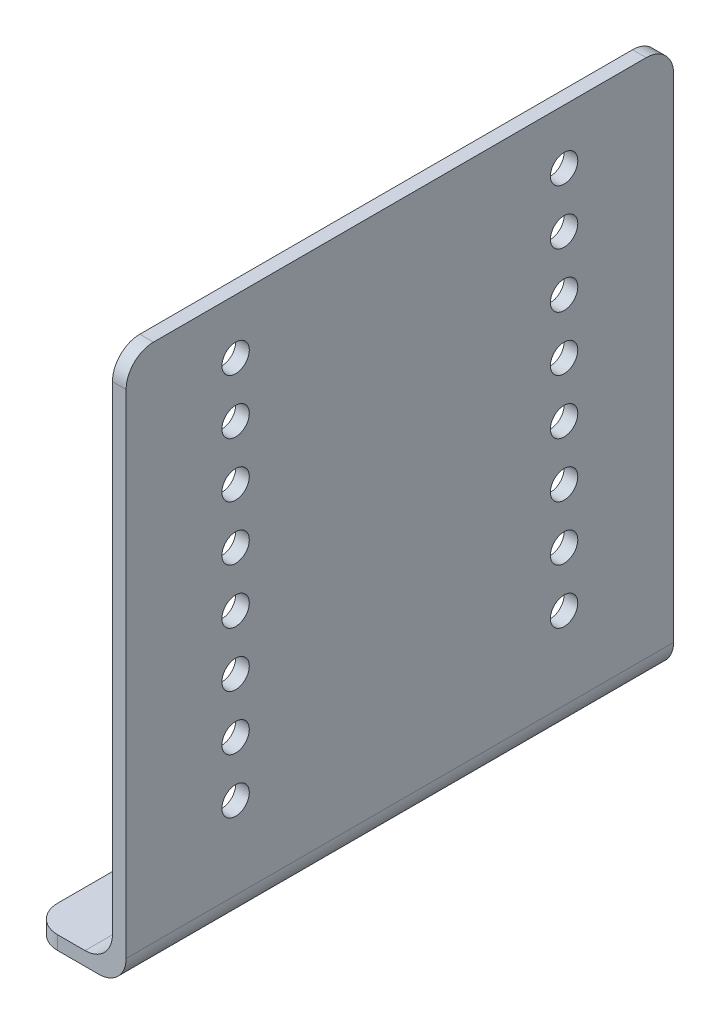
ISO-10303-21;
HEADER;
FILE_DESCRIPTION(('STEP AP214'),'2;1');
FILE_NAME('part.step','',(''),(''),'','','');
FILE_SCHEMA(('AUTOMOTIVE_DESIGN { 1 0 10303 214 1 1 1 1 }'));
ENDSEC;
DATA;
#1=APPLICATION_CONTEXT('core data for automotive mechanical design processes');
#2=APPLICATION_PROTOCOL_DEFINITION('international standard','automotive_design',2000,#1);
#3=PRODUCT_CONTEXT('',#1,'mechanical');
#4=PRODUCT('Part','Part','',(#3));
#5=PRODUCT_RELATED_PRODUCT_CATEGORY('part','',(#4));
#6=PRODUCT_DEFINITION_FORMATION('','',#4);
#7=PRODUCT_DEFINITION_CONTEXT('part definition',#1,'design');
#8=PRODUCT_DEFINITION('design','',#6,#7);
#9=PRODUCT_DEFINITION_SHAPE('','',#8);
#10=(LENGTH_UNIT() NAMED_UNIT(*) SI_UNIT(.MILLI.,.METRE.));
#11=(NAMED_UNIT(*) PLANE_ANGLE_UNIT() SI_UNIT($,.RADIAN.));
#12=(NAMED_UNIT(*) SI_UNIT($,.STERADIAN.) SOLID_ANGLE_UNIT());
#13=UNCERTAINTY_MEASURE_WITH_UNIT(LENGTH_MEASURE(1.E-05),#10,'distance_accuracy_value','');
#14=(GEOMETRIC_REPRESENTATION_CONTEXT(3) GLOBAL_UNCERTAINTY_ASSIGNED_CONTEXT((#13)) GLOBAL_UNIT_ASSIGNED_CONTEXT((#10,
#11,#12)) REPRESENTATION_CONTEXT('',''));
#15=CARTESIAN_POINT('',(0.,0.,0.));
#16=DIRECTION('',(0.,0.,1.));
#17=DIRECTION('',(1.,0.,0.));
#18=AXIS2_PLACEMENT_3D('',#15,#16,#17);
#19=CARTESIAN_POINT('',(0.,190.,-10.));
#20=DIRECTION('',(1.,0.,0.));
#21=DIRECTION('',(0.,0.,-1.));
#22=AXIS2_PLACEMENT_3D('',#19,#20,#21);
#23=PLANE('',#22);
#24=CARTESIAN_POINT('',(0.,180.,-160.));
#25=DIRECTION('',(1.,0.,0.));
#26=DIRECTION('',(0.,0.,-1.));
#27=AXIS2_PLACEMENT_3D('',#24,#25,#26);
#28=CIRCLE('',#27,4.99999999999999);
#29=CARTESIAN_POINT('',(0.,180.,-165.));
#30=VERTEX_POINT('',#29);
#31=EDGE_CURVE('E189',#30,#30,#28,.T.);
#32=ORIENTED_EDGE('',*,*,#31,.T.);
#33=EDGE_LOOP('',(#32));
#34=FACE_BOUND('',#33,.T.);
#35=CARTESIAN_POINT('',(0.,160.,-160.));
#36=DIRECTION('',(1.,0.,0.));
#37=DIRECTION('',(0.,0.,-1.));
#38=AXIS2_PLACEMENT_3D('',#35,#36,#37);
#39=CIRCLE('',#38,4.99999999999999);
#40=CARTESIAN_POINT('',(0.,160.,-165.));
#41=VERTEX_POINT('',#40);
#42=EDGE_CURVE('E193',#41,#41,#39,.T.);
#43=ORIENTED_EDGE('',*,*,#42,.T.);
#44=EDGE_LOOP('',(#43));
#45=FACE_BOUND('',#44,.T.);
#46=CARTESIAN_POINT('',(0.,140.,-160.));
#47=DIRECTION('',(1.,0.,0.));
#48=DIRECTION('',(0.,0.,-1.));
#49=AXIS2_PLACEMENT_3D('',#46,#47,#48);
#50=CIRCLE('',#49,4.99999999999999);
#51=CARTESIAN_POINT('',(0.,140.,-165.));
#52=VERTEX_POINT('',#51);
#53=EDGE_CURVE('E199',#52,#52,#50,.T.);
#54=ORIENTED_EDGE('',*,*,#53,.T.);
#55=EDGE_LOOP('',(#54));
#56=FACE_BOUND('',#55,.T.);
#57=CARTESIAN_POINT('',(0.,120.,-160.));
#58=DIRECTION('',(1.,0.,0.));
#59=DIRECTION('',(0.,0.,-1.));
#60=AXIS2_PLACEMENT_3D('',#57,#58,#59);
#61=CIRCLE('',#60,4.99999999999999);
#62=CARTESIAN_POINT('',(0.,120.,-165.));
#63=VERTEX_POINT('',#62);
#64=EDGE_CURVE('E205',#63,#63,#61,.T.);
#65=ORIENTED_EDGE('',*,*,#64,.T.);
#66=EDGE_LOOP('',(#65));
#67=FACE_BOUND('',#66,.T.);
#68=CARTESIAN_POINT('',(0.,100.,-160.));
#69=DIRECTION('',(1.,0.,0.));
#70=DIRECTION('',(0.,0.,-1.));
#71=AXIS2_PLACEMENT_3D('',#68,#69,#70);
#72=CIRCLE('',#71,4.99999999999999);
#73=CARTESIAN_POINT('',(0.,100.,-165.));
#74=VERTEX_POINT('',#73);
#75=EDGE_CURVE('E211',#74,#74,#72,.T.);
#76=ORIENTED_EDGE('',*,*,#75,.T.);
#77=EDGE_LOOP('',(#76));
#78=FACE_BOUND('',#77,.T.);
#79=CARTESIAN_POINT('',(0.,80.,-160.));
#80=DIRECTION('',(1.,0.,0.));
#81=DIRECTION('',(0.,0.,-1.));
#82=AXIS2_PLACEMENT_3D('',#79,#80,#81);
#83=CIRCLE('',#82,4.99999999999999);
#84=CARTESIAN_POINT('',(0.,80.,-165.));
#85=VERTEX_POINT('',#84);
#86=EDGE_CURVE('E217',#85,#85,#83,.T.);
#87=ORIENTED_EDGE('',*,*,#86,.T.);
#88=EDGE_LOOP('',(#87));
#89=FACE_BOUND('',#88,.T.);
#90=CARTESIAN_POINT('',(0.,60.,-160.));
#91=DIRECTION('',(1.,0.,0.));
#92=DIRECTION('',(0.,0.,-1.));
#93=AXIS2_PLACEMENT_3D('',#90,#91,#92);
#94=CIRCLE('',#93,4.99999999999999);
#95=CARTESIAN_POINT('',(0.,60.,-165.));
#96=VERTEX_POINT('',#95);
#97=EDGE_CURVE('E223',#96,#96,#94,.T.);
#98=ORIENTED_EDGE('',*,*,#97,.T.);
#99=EDGE_LOOP('',(#98));
#100=FACE_BOUND('',#99,.T.);
#101=CARTESIAN_POINT('',(0.,40.,-160.));
#102=DIRECTION('',(1.,0.,0.));
#103=DIRECTION('',(0.,0.,-1.));
#104=AXIS2_PLACEMENT_3D('',#101,#102,#103);
#105=CIRCLE('',#104,4.99999999999999);
#106=CARTESIAN_POINT('',(0.,40.,-165.));
#107=VERTEX_POINT('',#106);
#108=EDGE_CURVE('E229',#107,#107,#105,.T.);
#109=ORIENTED_EDGE('',*,*,#108,.T.);
#110=EDGE_LOOP('',(#109));
#111=FACE_BOUND('',#110,.T.);
#112=CARTESIAN_POINT('',(0.,180.,-40.));
#113=DIRECTION('',(1.,0.,0.));
#114=DIRECTION('',(0.,0.,-1.));
#115=AXIS2_PLACEMENT_3D('',#112,#113,#114);
#116=CIRCLE('',#115,5.00000000000001);
#117=CARTESIAN_POINT('',(0.,180.,-45.));
#118=VERTEX_POINT('',#117);
#119=EDGE_CURVE('E235',#118,#118,#116,.T.);
#120=ORIENTED_EDGE('',*,*,#119,.T.);
#121=EDGE_LOOP('',(#120));
#122=FACE_BOUND('',#121,.T.);
#123=CARTESIAN_POINT('',(0.,160.,-40.));
#124=DIRECTION('',(1.,0.,0.));
#125=DIRECTION('',(0.,0.,-1.));
#126=AXIS2_PLACEMENT_3D('',#123,#124,#125);
#127=CIRCLE('',#126,5.00000000000001);
#128=CARTESIAN_POINT('',(0.,160.,-45.));
#129=VERTEX_POINT('',#128);
#130=EDGE_CURVE('E241',#129,#129,#127,.T.);
#131=ORIENTED_EDGE('',*,*,#130,.T.);
#132=EDGE_LOOP('',(#131));
#133=FACE_BOUND('',#132,.T.);
#134=CARTESIAN_POINT('',(0.,140.,-40.));
#135=DIRECTION('',(1.,0.,0.));
#136=DIRECTION('',(0.,0.,-1.));
#137=AXIS2_PLACEMENT_3D('',#134,#135,#136);
#138=CIRCLE('',#137,5.00000000000001);
#139=CARTESIAN_POINT('',(0.,140.,-45.));
#140=VERTEX_POINT('',#139);
#141=EDGE_CURVE('E247',#140,#140,#138,.T.);
#142=ORIENTED_EDGE('',*,*,#141,.T.);
#143=EDGE_LOOP('',(#142));
#144=FACE_BOUND('',#143,.T.);
#145=CARTESIAN_POINT('',(0.,120.,-40.));
#146=DIRECTION('',(1.,0.,0.));
#147=DIRECTION('',(0.,0.,-1.));
#148=AXIS2_PLACEMENT_3D('',#145,#146,#147);
#149=CIRCLE('',#148,5.00000000000001);
#150=CARTESIAN_POINT('',(0.,120.,-45.));
#151=VERTEX_POINT('',#150);
#152=EDGE_CURVE('E253',#151,#151,#149,.T.);
#153=ORIENTED_EDGE('',*,*,#152,.T.);
#154=EDGE_LOOP('',(#153));
#155=FACE_BOUND('',#154,.T.);
#156=CARTESIAN_POINT('',(0.,100.,-40.));
#157=DIRECTION('',(1.,0.,0.));
#158=DIRECTION('',(0.,0.,-1.));
#159=AXIS2_PLACEMENT_3D('',#156,#157,#158);
#160=CIRCLE('',#159,5.00000000000001);
#161=CARTESIAN_POINT('',(0.,100.,-45.));
#162=VERTEX_POINT('',#161);
#163=EDGE_CURVE('E259',#162,#162,#160,.T.);
#164=ORIENTED_EDGE('',*,*,#163,.T.);
#165=EDGE_LOOP('',(#164));
#166=FACE_BOUND('',#165,.T.);
#167=CARTESIAN_POINT('',(0.,80.,-40.));
#168=DIRECTION('',(1.,0.,0.));
#169=DIRECTION('',(0.,0.,-1.));
#170=AXIS2_PLACEMENT_3D('',#167,#168,#169);
#171=CIRCLE('',#170,5.00000000000001);
#172=CARTESIAN_POINT('',(0.,80.,-45.));
#173=VERTEX_POINT('',#172);
#174=EDGE_CURVE('E265',#173,#173,#171,.T.);
#175=ORIENTED_EDGE('',*,*,#174,.T.);
#176=EDGE_LOOP('',(#175));
#177=FACE_BOUND('',#176,.T.);
#178=CARTESIAN_POINT('',(0.,60.,-40.));
#179=DIRECTION('',(1.,0.,0.));
#180=DIRECTION('',(0.,0.,-1.));
#181=AXIS2_PLACEMENT_3D('',#178,#179,#180);
#182=CIRCLE('',#181,5.00000000000001);
#183=CARTESIAN_POINT('',(0.,60.,-45.));
#184=VERTEX_POINT('',#183);
#185=EDGE_CURVE('E271',#184,#184,#182,.T.);
#186=ORIENTED_EDGE('',*,*,#185,.T.);
#187=EDGE_LOOP('',(#186));
#188=FACE_BOUND('',#187,.T.);
#189=CARTESIAN_POINT('',(0.,40.,-40.));
#190=DIRECTION('',(1.,0.,0.));
#191=DIRECTION('',(0.,0.,-1.));
#192=AXIS2_PLACEMENT_3D('',#189,#190,#191);
#193=CIRCLE('',#192,5.00000000000001);
#194=CARTESIAN_POINT('',(0.,40.,-45.));
#195=VERTEX_POINT('',#194);
#196=EDGE_CURVE('E277',#195,#195,#193,.T.);
#197=ORIENTED_EDGE('',*,*,#196,.T.);
#198=EDGE_LOOP('',(#197));
#199=FACE_BOUND('',#198,.T.);
#200=DIRECTION('',(0.,0.,1.));
#201=VECTOR('',#200,1.);
#202=CARTESIAN_POINT('',(0.,15.,-200.));
#203=LINE('',#202,#201);
#204=CARTESIAN_POINT('',(0.,15.,-200.));
#205=VERTEX_POINT('',#204);
#206=CARTESIAN_POINT('',(0.,15.,0.));
#207=VERTEX_POINT('',#206);
#208=EDGE_CURVE('E163',#205,#207,#203,.T.);
#209=ORIENTED_EDGE('',*,*,#208,.T.);
#210=DIRECTION('',(0.,-1.,0.));
#211=VECTOR('',#210,1.);
#212=CARTESIAN_POINT('',(0.,0.,0.));
#213=LINE('',#212,#211);
#214=CARTESIAN_POINT('',(0.,190.,0.));
#215=VERTEX_POINT('',#214);
#216=EDGE_CURVE('E283',#215,#207,#213,.T.);
#217=ORIENTED_EDGE('',*,*,#216,.F.);
#218=CARTESIAN_POINT('',(0.,190.,-10.));
#219=DIRECTION('',(1.,0.,0.));
#220=DIRECTION('',(0.,0.,-1.));
#221=AXIS2_PLACEMENT_3D('',#218,#219,#220);
#222=CIRCLE('',#221,10.);
#223=CARTESIAN_POINT('',(0.,200.,-10.0000000000001));
#224=VERTEX_POINT('',#223);
#225=EDGE_CURVE('E290',#224,#215,#222,.T.);
#226=ORIENTED_EDGE('',*,*,#225,.F.);
#227=DIRECTION('',(0.,0.,1.));
#228=VECTOR('',#227,1.);
#229=CARTESIAN_POINT('',(0.,200.,-10.0000000000001));
#230=LINE('',#229,#228);
#231=CARTESIAN_POINT('',(0.,200.,-190.));
#232=VERTEX_POINT('',#231);
#233=EDGE_CURVE('E305',#232,#224,#230,.T.);
#234=ORIENTED_EDGE('',*,*,#233,.F.);
#235=CARTESIAN_POINT('',(0.,190.,-190.));
#236=DIRECTION('',(1.,0.,0.));
#237=DIRECTION('',(0.,0.,1.));
#238=AXIS2_PLACEMENT_3D('',#235,#236,#237);
#239=CIRCLE('',#238,10.);
#240=CARTESIAN_POINT('',(0.,190.,-200.));
#241=VERTEX_POINT('',#240);
#242=EDGE_CURVE('E303',#241,#232,#239,.T.);
#243=ORIENTED_EDGE('',*,*,#242,.F.);
#244=DIRECTION('',(0.,1.,0.));
#245=VECTOR('',#244,1.);
#246=CARTESIAN_POINT('',(0.,0.,-200.));
#247=LINE('',#246,#245);
#248=EDGE_CURVE('E301',#205,#241,#247,.T.);
#249=ORIENTED_EDGE('',*,*,#248,.F.);
#250=EDGE_LOOP('',(#209,#217,#226,#234,#243,#249));
#251=FACE_BOUND('',#250,.T.);
#252=ADVANCED_FACE('F35',(#34,#45,#56,#67,#78,#89,#100,#111,#122,#133,#144,#155,#166,#177,#188,
#199,#251),#23,.F.);
#253=DIRECTION('',(0.,-1.,0.));
#254=VECTOR('',#253,1.);
#255=CARTESIAN_POINT('',(0.,0.,-199.496057237048));
#256=LINE('',#255,#254);
#257=CARTESIAN_POINT('',(0.,5.,-199.496057237048));
#258=VERTEX_POINT('',#257);
#259=CARTESIAN_POINT('',(0.,1.33974596215562,-199.496057237048));
#260=VERTEX_POINT('',#259);
#261=EDGE_CURVE('E173',#258,#260,#256,.T.);
#262=ORIENTED_EDGE('',*,*,#261,.F.);
#263=DIRECTION('',(0.,0.,1.));
#264=VECTOR('',#263,1.);
#265=CARTESIAN_POINT('',(0.,5.,-200.));
#266=LINE('',#265,#264);
#267=CARTESIAN_POINT('',(0.,5.,-200.));
#268=VERTEX_POINT('',#267);
#269=EDGE_CURVE('E149',#268,#258,#266,.T.);
#270=ORIENTED_EDGE('',*,*,#269,.F.);
#271=CARTESIAN_POINT('',(0.,1.33974596215562,-200.));
#272=VERTEX_POINT('',#271);
#273=EDGE_CURVE('E158',#272,#268,#247,.T.);
#274=ORIENTED_EDGE('',*,*,#273,.F.);
#275=DIRECTION('',(0.,0.,1.));
#276=VECTOR('',#275,1.);
#277=CARTESIAN_POINT('',(0.,1.33974596215562,-200.));
#278=LINE('',#277,#276);
#279=EDGE_CURVE('E327',#272,#260,#278,.T.);
#280=ORIENTED_EDGE('',*,*,#279,.T.);
#281=EDGE_LOOP('',(#262,#270,#274,#280));
#282=FACE_BOUND('',#281,.T.);
#283=ADVANCED_FACE('F387',(#282),#23,.F.);
#284=CARTESIAN_POINT('',(5.,190.,-10.));
#285=DIRECTION('',(1.,0.,0.));
#286=DIRECTION('',(0.,0.,-1.));
#287=AXIS2_PLACEMENT_3D('',#284,#285,#286);
#288=PLANE('',#287);
#289=CARTESIAN_POINT('',(5.,160.,-160.));
#290=DIRECTION('',(1.,0.,0.));
#291=DIRECTION('',(0.,0.,-1.));
#292=AXIS2_PLACEMENT_3D('',#289,#290,#291);
#293=CIRCLE('',#292,4.99999999999999);
#294=CARTESIAN_POINT('',(5.,160.,-165.));
#295=VERTEX_POINT('',#294);
#296=EDGE_CURVE('E196',#295,#295,#293,.T.);
#297=ORIENTED_EDGE('',*,*,#296,.F.);
#298=EDGE_LOOP('',(#297));
#299=FACE_BOUND('',#298,.T.);
#300=CARTESIAN_POINT('',(5.,120.,-160.));
#301=DIRECTION('',(1.,0.,0.));
#302=DIRECTION('',(0.,0.,-1.));
#303=AXIS2_PLACEMENT_3D('',#300,#301,#302);
#304=CIRCLE('',#303,4.99999999999999);
#305=CARTESIAN_POINT('',(5.,120.,-165.));
#306=VERTEX_POINT('',#305);
#307=EDGE_CURVE('E208',#306,#306,#304,.T.);
#308=ORIENTED_EDGE('',*,*,#307,.F.);
#309=EDGE_LOOP('',(#308));
#310=FACE_BOUND('',#309,.T.);
#311=CARTESIAN_POINT('',(5.,80.,-160.));
#312=DIRECTION('',(1.,0.,0.));
#313=DIRECTION('',(0.,0.,-1.));
#314=AXIS2_PLACEMENT_3D('',#311,#312,#313);
#315=CIRCLE('',#314,4.99999999999999);
#316=CARTESIAN_POINT('',(5.,80.,-165.));
#317=VERTEX_POINT('',#316);
#318=EDGE_CURVE('E220',#317,#317,#315,.T.);
#319=ORIENTED_EDGE('',*,*,#318,.F.);
#320=EDGE_LOOP('',(#319));
#321=FACE_BOUND('',#320,.T.);
#322=CARTESIAN_POINT('',(5.,40.,-160.));
#323=DIRECTION('',(1.,0.,0.));
#324=DIRECTION('',(0.,0.,-1.));
#325=AXIS2_PLACEMENT_3D('',#322,#323,#324);
#326=CIRCLE('',#325,4.99999999999999);
#327=CARTESIAN_POINT('',(5.,40.,-165.));
#328=VERTEX_POINT('',#327);
#329=EDGE_CURVE('E232',#328,#328,#326,.T.);
#330=ORIENTED_EDGE('',*,*,#329,.F.);
#331=EDGE_LOOP('',(#330));
#332=FACE_BOUND('',#331,.T.);
#333=CARTESIAN_POINT('',(5.,160.,-40.));
#334=DIRECTION('',(1.,0.,0.));
#335=DIRECTION('',(0.,0.,-1.));
#336=AXIS2_PLACEMENT_3D('',#333,#334,#335);
#337=CIRCLE('',#336,5.00000000000001);
#338=CARTESIAN_POINT('',(5.,160.,-45.));
#339=VERTEX_POINT('',#338);
#340=EDGE_CURVE('E244',#339,#339,#337,.T.);
#341=ORIENTED_EDGE('',*,*,#340,.F.);
#342=EDGE_LOOP('',(#341));
#343=FACE_BOUND('',#342,.T.);
#344=CARTESIAN_POINT('',(5.,120.,-40.));
#345=DIRECTION('',(1.,0.,0.));
#346=DIRECTION('',(0.,0.,-1.));
#347=AXIS2_PLACEMENT_3D('',#344,#345,#346);
#348=CIRCLE('',#347,5.00000000000001);
#349=CARTESIAN_POINT('',(5.,120.,-45.));
#350=VERTEX_POINT('',#349);
#351=EDGE_CURVE('E256',#350,#350,#348,.T.);
#352=ORIENTED_EDGE('',*,*,#351,.F.);
#353=EDGE_LOOP('',(#352));
#354=FACE_BOUND('',#353,.T.);
#355=CARTESIAN_POINT('',(5.,80.,-40.));
#356=DIRECTION('',(1.,0.,0.));
#357=DIRECTION('',(0.,0.,-1.));
#358=AXIS2_PLACEMENT_3D('',#355,#356,#357);
#359=CIRCLE('',#358,5.00000000000001);
#360=CARTESIAN_POINT('',(5.,80.,-45.));
#361=VERTEX_POINT('',#360);
#362=EDGE_CURVE('E268',#361,#361,#359,.T.);
#363=ORIENTED_EDGE('',*,*,#362,.F.);
#364=EDGE_LOOP('',(#363));
#365=FACE_BOUND('',#364,.T.);
#366=CARTESIAN_POINT('',(5.,40.,-40.));
#367=DIRECTION('',(1.,0.,0.));
#368=DIRECTION('',(0.,0.,-1.));
#369=AXIS2_PLACEMENT_3D('',#366,#367,#368);
#370=CIRCLE('',#369,5.00000000000001);
#371=CARTESIAN_POINT('',(5.,40.,-45.));
#372=VERTEX_POINT('',#371);
#373=EDGE_CURVE('E280',#372,#372,#370,.T.);
#374=ORIENTED_EDGE('',*,*,#373,.F.);
#375=EDGE_LOOP('',(#374));
#376=FACE_BOUND('',#375,.T.);
#377=DIRECTION('',(0.,-1.,0.));
#378=VECTOR('',#377,1.);
#379=CARTESIAN_POINT('',(5.,0.,0.));
#380=LINE('',#379,#378);
#381=CARTESIAN_POINT('',(5.,190.,0.));
#382=VERTEX_POINT('',#381);
#383=CARTESIAN_POINT('',(5.,10.,0.));
#384=VERTEX_POINT('',#383);
#385=EDGE_CURVE('E286',#382,#384,#380,.T.);
#386=ORIENTED_EDGE('',*,*,#385,.T.);
#387=DIRECTION('',(0.,0.,-1.));
#388=VECTOR('',#387,1.);
#389=CARTESIAN_POINT('',(5.,10.,-200.));
#390=LINE('',#389,#388);
#391=CARTESIAN_POINT('',(5.,10.,-200.));
#392=VERTEX_POINT('',#391);
#393=EDGE_CURVE('E322',#384,#392,#390,.T.);
#394=ORIENTED_EDGE('',*,*,#393,.T.);
#395=DIRECTION('',(0.,1.,0.));
#396=VECTOR('',#395,1.);
#397=CARTESIAN_POINT('',(5.,0.,-200.));
#398=LINE('',#397,#396);
#399=CARTESIAN_POINT('',(5.,190.,-200.));
#400=VERTEX_POINT('',#399);
#401=EDGE_CURVE('E289',#392,#400,#398,.T.);
#402=ORIENTED_EDGE('',*,*,#401,.T.);
#403=CARTESIAN_POINT('',(5.,190.,-190.));
#404=DIRECTION('',(1.,0.,0.));
#405=DIRECTION('',(0.,0.,1.));
#406=AXIS2_PLACEMENT_3D('',#403,#404,#405);
#407=CIRCLE('',#406,10.);
#408=CARTESIAN_POINT('',(5.,200.,-190.));
#409=VERTEX_POINT('',#408);
#410=EDGE_CURVE('E292',#400,#409,#407,.T.);
#411=ORIENTED_EDGE('',*,*,#410,.T.);
#412=DIRECTION('',(0.,0.,1.));
#413=VECTOR('',#412,1.);
#414=CARTESIAN_POINT('',(5.,200.,-10.0000000000001));
#415=LINE('',#414,#413);
#416=CARTESIAN_POINT('',(5.,200.,-10.0000000000001));
#417=VERTEX_POINT('',#416);
#418=EDGE_CURVE('E294',#409,#417,#415,.T.);
#419=ORIENTED_EDGE('',*,*,#418,.T.);
#420=CARTESIAN_POINT('',(5.,190.,-10.));
#421=DIRECTION('',(1.,0.,0.));
#422=DIRECTION('',(0.,0.,-1.));
#423=AXIS2_PLACEMENT_3D('',#420,#421,#422);
#424=CIRCLE('',#423,10.);
#425=EDGE_CURVE('E296',#417,#382,#424,.T.);
#426=ORIENTED_EDGE('',*,*,#425,.T.);
#427=EDGE_LOOP('',(#386,#394,#402,#411,#419,#426));
#428=FACE_BOUND('',#427,.T.);
#429=CARTESIAN_POINT('',(5.,60.,-40.));
#430=DIRECTION('',(1.,0.,0.));
#431=DIRECTION('',(0.,0.,-1.));
#432=AXIS2_PLACEMENT_3D('',#429,#430,#431);
#433=CIRCLE('',#432,5.00000000000001);
#434=CARTESIAN_POINT('',(5.,60.,-45.));
#435=VERTEX_POINT('',#434);
#436=EDGE_CURVE('E274',#435,#435,#433,.T.);
#437=ORIENTED_EDGE('',*,*,#436,.F.);
#438=EDGE_LOOP('',(#437));
#439=FACE_BOUND('',#438,.T.);
#440=CARTESIAN_POINT('',(5.,100.,-40.));
#441=DIRECTION('',(1.,0.,0.));
#442=DIRECTION('',(0.,0.,-1.));
#443=AXIS2_PLACEMENT_3D('',#440,#441,#442);
#444=CIRCLE('',#443,5.00000000000001);
#445=CARTESIAN_POINT('',(5.,100.,-45.));
#446=VERTEX_POINT('',#445);
#447=EDGE_CURVE('E262',#446,#446,#444,.T.);
#448=ORIENTED_EDGE('',*,*,#447,.F.);
#449=EDGE_LOOP('',(#448));
#450=FACE_BOUND('',#449,.T.);
#451=CARTESIAN_POINT('',(5.,140.,-40.));
#452=DIRECTION('',(1.,0.,0.));
#453=DIRECTION('',(0.,0.,-1.));
#454=AXIS2_PLACEMENT_3D('',#451,#452,#453);
#455=CIRCLE('',#454,5.00000000000001);
#456=CARTESIAN_POINT('',(5.,140.,-45.));
#457=VERTEX_POINT('',#456);
#458=EDGE_CURVE('E250',#457,#457,#455,.T.);
#459=ORIENTED_EDGE('',*,*,#458,.F.);
#460=EDGE_LOOP('',(#459));
#461=FACE_BOUND('',#460,.T.);
#462=CARTESIAN_POINT('',(5.,180.,-40.));
#463=DIRECTION('',(1.,0.,0.));
#464=DIRECTION('',(0.,0.,-1.));
#465=AXIS2_PLACEMENT_3D('',#462,#463,#464);
#466=CIRCLE('',#465,5.00000000000001);
#467=CARTESIAN_POINT('',(5.,180.,-45.));
#468=VERTEX_POINT('',#467);
#469=EDGE_CURVE('E238',#468,#468,#466,.T.);
#470=ORIENTED_EDGE('',*,*,#469,.F.);
#471=EDGE_LOOP('',(#470));
#472=FACE_BOUND('',#471,.T.);
#473=CARTESIAN_POINT('',(5.,60.,-160.));
#474=DIRECTION('',(1.,0.,0.));
#475=DIRECTION('',(0.,0.,-1.));
#476=AXIS2_PLACEMENT_3D('',#473,#474,#475);
#477=CIRCLE('',#476,4.99999999999999);
#478=CARTESIAN_POINT('',(5.,60.,-165.));
#479=VERTEX_POINT('',#478);
#480=EDGE_CURVE('E226',#479,#479,#477,.T.);
#481=ORIENTED_EDGE('',*,*,#480,.F.);
#482=EDGE_LOOP('',(#481));
#483=FACE_BOUND('',#482,.T.);
#484=CARTESIAN_POINT('',(5.,100.,-160.));
#485=DIRECTION('',(1.,0.,0.));
#486=DIRECTION('',(0.,0.,-1.));
#487=AXIS2_PLACEMENT_3D('',#484,#485,#486);
#488=CIRCLE('',#487,4.99999999999999);
#489=CARTESIAN_POINT('',(5.,100.,-165.));
#490=VERTEX_POINT('',#489);
#491=EDGE_CURVE('E214',#490,#490,#488,.T.);
#492=ORIENTED_EDGE('',*,*,#491,.F.);
#493=EDGE_LOOP('',(#492));
#494=FACE_BOUND('',#493,.T.);
#495=CARTESIAN_POINT('',(5.,140.,-160.));
#496=DIRECTION('',(1.,0.,0.));
#497=DIRECTION('',(0.,0.,-1.));
#498=AXIS2_PLACEMENT_3D('',#495,#496,#497);
#499=CIRCLE('',#498,4.99999999999999);
#500=CARTESIAN_POINT('',(5.,140.,-165.));
#501=VERTEX_POINT('',#500);
#502=EDGE_CURVE('E202',#501,#501,#499,.T.);
#503=ORIENTED_EDGE('',*,*,#502,.F.);
#504=EDGE_LOOP('',(#503));
#505=FACE_BOUND('',#504,.T.);
#506=CARTESIAN_POINT('',(5.,180.,-160.));
#507=DIRECTION('',(1.,0.,0.));
#508=DIRECTION('',(0.,0.,-1.));
#509=AXIS2_PLACEMENT_3D('',#506,#507,#508);
#510=CIRCLE('',#509,4.99999999999999);
#511=CARTESIAN_POINT('',(5.,180.,-165.));
#512=VERTEX_POINT('',#511);
#513=EDGE_CURVE('E190',#512,#512,#510,.T.);
#514=ORIENTED_EDGE('',*,*,#513,.F.);
#515=EDGE_LOOP('',(#514));
#516=FACE_BOUND('',#515,.T.);
#517=ADVANCED_FACE('F393',(#299,#310,#321,#332,#343,#354,#365,#376,#428,#439,#450,#461,#472,
#483,#494,#505,#516),#288,.T.);
#518=CARTESIAN_POINT('',(5.,0.,0.));
#519=DIRECTION('',(0.,0.,-1.));
#520=DIRECTION('',(-1.,0.,0.));
#521=AXIS2_PLACEMENT_3D('',#518,#519,#520);
#522=PLANE('',#521);
#523=DIRECTION('',(1.,0.,0.));
#524=VECTOR('',#523,1.);
#525=CARTESIAN_POINT('',(-30.,5.,0.));
#526=LINE('',#525,#524);
#527=CARTESIAN_POINT('',(-20.,5.,0.));
#528=VERTEX_POINT('',#527);
#529=CARTESIAN_POINT('',(-10.,5.,0.));
#530=VERTEX_POINT('',#529);
#531=EDGE_CURVE('E185',#528,#530,#526,.T.);
#532=ORIENTED_EDGE('',*,*,#531,.F.);
#533=DIRECTION('',(0.,1.,0.));
#534=VECTOR('',#533,1.);
#535=CARTESIAN_POINT('',(-20.,0.,0.));
#536=LINE('',#535,#534);
#537=CARTESIAN_POINT('',(-20.,0.,0.));
#538=VERTEX_POINT('',#537);
#539=EDGE_CURVE('E11',#528,#538,#536,.F.);
#540=ORIENTED_EDGE('',*,*,#539,.T.);
#541=DIRECTION('',(-1.,0.,0.));
#542=VECTOR('',#541,1.);
#543=CARTESIAN_POINT('',(5.,0.,0.));
#544=LINE('',#543,#542);
#545=CARTESIAN_POINT('',(-5.,0.,0.));
#546=VERTEX_POINT('',#545);
#547=EDGE_CURVE('E319',#546,#538,#544,.T.);
#548=ORIENTED_EDGE('',*,*,#547,.F.);
#549=CARTESIAN_POINT('',(-5.,10.,0.));
#550=DIRECTION('',(0.,0.,-1.));
#551=DIRECTION('',(-1.,0.,0.));
#552=AXIS2_PLACEMENT_3D('',#549,#550,#551);
#553=CIRCLE('',#552,10.);
#554=EDGE_CURVE('E334',#546,#384,#553,.F.);
#555=ORIENTED_EDGE('',*,*,#554,.T.);
#556=ORIENTED_EDGE('',*,*,#385,.F.);
#557=DIRECTION('',(-1.,0.,0.));
#558=VECTOR('',#557,1.);
#559=CARTESIAN_POINT('',(5.,190.,0.));
#560=LINE('',#559,#558);
#561=EDGE_CURVE('E298',#382,#215,#560,.T.);
#562=ORIENTED_EDGE('',*,*,#561,.T.);
#563=ORIENTED_EDGE('',*,*,#216,.T.);
#564=CARTESIAN_POINT('',(-10.,15.,0.));
#565=DIRECTION('',(0.,0.,-1.));
#566=DIRECTION('',(1.,0.,0.));
#567=AXIS2_PLACEMENT_3D('',#564,#565,#566);
#568=CIRCLE('',#567,10.);
#569=EDGE_CURVE('E164',#207,#530,#568,.T.);
#570=ORIENTED_EDGE('',*,*,#569,.T.);
#571=EDGE_LOOP('',(#532,#540,#548,#555,#556,#562,#563,#570));
#572=FACE_BOUND('',#571,.T.);
#573=ADVANCED_FACE('F373',(#572),#522,.F.);
#574=CARTESIAN_POINT('',(5.,0.,0.));
#575=DIRECTION('',(0.,1.,0.));
#576=DIRECTION('',(0.,0.,1.));
#577=AXIS2_PLACEMENT_3D('',#574,#575,#576);
#578=PLANE('',#577);
#579=CARTESIAN_POINT('',(-20.,0.,-169.496057237048));
#580=DIRECTION('',(0.,1.,0.));
#581=DIRECTION('',(0.,0.,1.));
#582=AXIS2_PLACEMENT_3D('',#579,#580,#581);
#583=CIRCLE('',#582,5.);
#584=CARTESIAN_POINT('',(-20.,0.,-164.496057237048));
#585=VERTEX_POINT('',#584);
#586=EDGE_CURVE('E167',#585,#585,#583,.T.);
#587=ORIENTED_EDGE('',*,*,#586,.T.);
#588=EDGE_LOOP('',(#587));
#589=FACE_BOUND('',#588,.T.);
#590=CARTESIAN_POINT('',(-20.,0.,-29.4960572370478));
#591=DIRECTION('',(0.,1.,0.));
#592=DIRECTION('',(0.,0.,1.));
#593=AXIS2_PLACEMENT_3D('',#590,#591,#592);
#594=CIRCLE('',#593,5.);
#595=CARTESIAN_POINT('',(-20.,0.,-24.4960572370478));
#596=VERTEX_POINT('',#595);
#597=EDGE_CURVE('E752',#596,#596,#594,.T.);
#598=ORIENTED_EDGE('',*,*,#597,.T.);
#599=EDGE_LOOP('',(#598));
#600=FACE_BOUND('',#599,.T.);
#601=DIRECTION('',(0.,0.,1.));
#602=VECTOR('',#601,1.);
#603=CARTESIAN_POINT('',(-30.,0.,-199.496057237048));
#604=LINE('',#603,#602);
#605=CARTESIAN_POINT('',(-30.,0.,-189.496057237048));
#606=VERTEX_POINT('',#605);
#607=CARTESIAN_POINT('',(-30.,0.,-10.));
#608=VERTEX_POINT('',#607);
#609=EDGE_CURVE('E175',#606,#608,#604,.T.);
#610=ORIENTED_EDGE('',*,*,#609,.F.);
#611=CARTESIAN_POINT('',(-20.,0.,-189.496057237048));
#612=DIRECTION('',(0.,1.,0.));
#613=DIRECTION('',(0.,0.,1.));
#614=AXIS2_PLACEMENT_3D('',#611,#612,#613);
#615=CIRCLE('',#614,10.);
#616=CARTESIAN_POINT('',(-20.,0.,-199.496057237048));
#617=VERTEX_POINT('',#616);
#618=EDGE_CURVE('E347',#606,#617,#615,.F.);
#619=ORIENTED_EDGE('',*,*,#618,.T.);
#620=DIRECTION('',(1.,0.,0.));
#621=VECTOR('',#620,1.);
#622=CARTESIAN_POINT('',(-30.,0.,-199.496057237048));
#623=LINE('',#622,#621);
#624=CARTESIAN_POINT('',(-5.,0.,-199.496057237048));
#625=VERTEX_POINT('',#624);
#626=EDGE_CURVE('E187',#617,#625,#623,.T.);
#627=ORIENTED_EDGE('',*,*,#626,.T.);
#628=DIRECTION('',(0.,0.,-1.));
#629=VECTOR('',#628,1.);
#630=CARTESIAN_POINT('',(-5.,0.,0.));
#631=LINE('',#630,#629);
#632=EDGE_CURVE('E332',#625,#546,#631,.F.);
#633=ORIENTED_EDGE('',*,*,#632,.T.);
#634=ORIENTED_EDGE('',*,*,#547,.T.);
#635=CARTESIAN_POINT('',(-20.,0.,-10.));
#636=DIRECTION('',(0.,1.,0.));
#637=DIRECTION('',(0.,0.,1.));
#638=AXIS2_PLACEMENT_3D('',#635,#636,#637);
#639=CIRCLE('',#638,10.);
#640=EDGE_CURVE('E345',#538,#608,#639,.F.);
#641=ORIENTED_EDGE('',*,*,#640,.T.);
#642=EDGE_LOOP('',(#610,#619,#627,#633,#634,#641));
#643=FACE_BOUND('',#642,.T.);
#644=ADVANCED_FACE('F360',(#589,#600,#643),#578,.F.);
#645=CARTESIAN_POINT('',(5.,0.,-200.));
#646=DIRECTION('',(0.,0.,1.));
#647=DIRECTION('',(1.,0.,0.));
#648=AXIS2_PLACEMENT_3D('',#645,#646,#647);
#649=PLANE('',#648);
#650=ORIENTED_EDGE('',*,*,#401,.F.);
#651=CARTESIAN_POINT('',(-5.,10.,-200.));
#652=DIRECTION('',(0.,0.,1.));
#653=DIRECTION('',(1.,0.,0.));
#654=AXIS2_PLACEMENT_3D('',#651,#652,#653);
#655=CIRCLE('',#654,10.);
#656=EDGE_CURVE('E325',#392,#272,#655,.F.);
#657=ORIENTED_EDGE('',*,*,#656,.T.);
#658=ORIENTED_EDGE('',*,*,#273,.T.);
#659=DIRECTION('',(1.,0.,0.));
#660=VECTOR('',#659,1.);
#661=CARTESIAN_POINT('',(0.,5.,-200.));
#662=LINE('',#661,#660);
#663=CARTESIAN_POINT('',(-10.,5.00000000000001,-200.));
#664=VERTEX_POINT('',#663);
#665=EDGE_CURVE('E144',#664,#268,#662,.T.);
#666=ORIENTED_EDGE('',*,*,#665,.F.);
#667=CARTESIAN_POINT('',(-10.,15.,-200.));
#668=DIRECTION('',(0.,0.,-1.));
#669=DIRECTION('',(1.,0.,0.));
#670=AXIS2_PLACEMENT_3D('',#667,#668,#669);
#671=CIRCLE('',#670,10.);
#672=EDGE_CURVE('E156',#205,#664,#671,.T.);
#673=ORIENTED_EDGE('',*,*,#672,.F.);
#674=ORIENTED_EDGE('',*,*,#248,.T.);
#675=DIRECTION('',(-1.,0.,0.));
#676=VECTOR('',#675,1.);
#677=CARTESIAN_POINT('',(5.,190.,-200.));
#678=LINE('',#677,#676);
#679=EDGE_CURVE('E316',#400,#241,#678,.T.);
#680=ORIENTED_EDGE('',*,*,#679,.F.);
#681=EDGE_LOOP('',(#650,#657,#658,#666,#673,#674,#680));
#682=FACE_BOUND('',#681,.T.);
#683=ADVANCED_FACE('F155',(#682),#649,.F.);
#684=CARTESIAN_POINT('',(5.,190.,-190.));
#685=DIRECTION('',(-1.,0.,0.));
#686=DIRECTION('',(0.,0.,1.));
#687=AXIS2_PLACEMENT_3D('',#684,#685,#686);
#688=CYLINDRICAL_SURFACE('',#687,10.);
#689=ORIENTED_EDGE('',*,*,#242,.T.);
#690=DIRECTION('',(-1.,0.,0.));
#691=VECTOR('',#690,1.);
#692=CARTESIAN_POINT('',(5.,200.,-190.));
#693=LINE('',#692,#691);
#694=EDGE_CURVE('E313',#409,#232,#693,.T.);
#695=ORIENTED_EDGE('',*,*,#694,.F.);
#696=ORIENTED_EDGE('',*,*,#410,.F.);
#697=ORIENTED_EDGE('',*,*,#679,.T.);
#698=EDGE_LOOP('',(#689,#695,#696,#697));
#699=FACE_BOUND('',#698,.T.);
#700=ADVANCED_FACE('F407',(#699),#688,.T.);
#701=CARTESIAN_POINT('',(5.,200.,-10.0000000000001));
#702=DIRECTION('',(0.,-1.,0.));
#703=DIRECTION('',(0.,0.,-1.));
#704=AXIS2_PLACEMENT_3D('',#701,#702,#703);
#705=PLANE('',#704);
#706=ORIENTED_EDGE('',*,*,#233,.T.);
#707=DIRECTION('',(-1.,0.,0.));
#708=VECTOR('',#707,1.);
#709=CARTESIAN_POINT('',(5.,200.,-10.0000000000001));
#710=LINE('',#709,#708);
#711=EDGE_CURVE('E310',#417,#224,#710,.T.);
#712=ORIENTED_EDGE('',*,*,#711,.F.);
#713=ORIENTED_EDGE('',*,*,#418,.F.);
#714=ORIENTED_EDGE('',*,*,#694,.T.);
#715=EDGE_LOOP('',(#706,#712,#713,#714));
#716=FACE_BOUND('',#715,.T.);
#717=ADVANCED_FACE('F403',(#716),#705,.F.);
#718=CARTESIAN_POINT('',(5.,190.,-10.));
#719=DIRECTION('',(-1.,0.,0.));
#720=DIRECTION('',(0.,0.,1.));
#721=AXIS2_PLACEMENT_3D('',#718,#719,#720);
#722=CYLINDRICAL_SURFACE('',#721,10.);
#723=ORIENTED_EDGE('',*,*,#225,.T.);
#724=ORIENTED_EDGE('',*,*,#561,.F.);
#725=ORIENTED_EDGE('',*,*,#425,.F.);
#726=ORIENTED_EDGE('',*,*,#711,.T.);
#727=EDGE_LOOP('',(#723,#724,#725,#726));
#728=FACE_BOUND('',#727,.T.);
#729=ADVANCED_FACE('F399',(#728),#722,.T.);
#730=CARTESIAN_POINT('',(5.,40.,-40.));
#731=DIRECTION('',(-1.,0.,0.));
#732=DIRECTION('',(0.,0.,1.));
#733=AXIS2_PLACEMENT_3D('',#730,#731,#732);
#734=CYLINDRICAL_SURFACE('',#733,5.00000000000001);
#735=ORIENTED_EDGE('',*,*,#373,.T.);
#736=EDGE_LOOP('',(#735));
#737=FACE_BOUND('',#736,.T.);
#738=ORIENTED_EDGE('',*,*,#196,.F.);
#739=EDGE_LOOP('',(#738));
#740=FACE_BOUND('',#739,.T.);
#741=ADVANCED_FACE('F402',(#737,#740),#734,.F.);
#742=CARTESIAN_POINT('',(5.,60.,-40.));
#743=DIRECTION('',(-1.,0.,0.));
#744=DIRECTION('',(0.,0.,1.));
#745=AXIS2_PLACEMENT_3D('',#742,#743,#744);
#746=CYLINDRICAL_SURFACE('',#745,5.00000000000001);
#747=ORIENTED_EDGE('',*,*,#436,.T.);
#748=EDGE_LOOP('',(#747));
#749=FACE_BOUND('',#748,.T.);
#750=ORIENTED_EDGE('',*,*,#185,.F.);
#751=EDGE_LOOP('',(#750));
#752=FACE_BOUND('',#751,.T.);
#753=ADVANCED_FACE('F490',(#749,#752),#746,.F.);
#754=CARTESIAN_POINT('',(5.,80.,-40.));
#755=DIRECTION('',(-1.,0.,0.));
#756=DIRECTION('',(0.,0.,1.));
#757=AXIS2_PLACEMENT_3D('',#754,#755,#756);
#758=CYLINDRICAL_SURFACE('',#757,5.00000000000001);
#759=ORIENTED_EDGE('',*,*,#362,.T.);
#760=EDGE_LOOP('',(#759));
#761=FACE_BOUND('',#760,.T.);
#762=ORIENTED_EDGE('',*,*,#174,.F.);
#763=EDGE_LOOP('',(#762));
#764=FACE_BOUND('',#763,.T.);
#765=ADVANCED_FACE('F486',(#761,#764),#758,.F.);
#766=CARTESIAN_POINT('',(5.,100.,-40.));
#767=DIRECTION('',(-1.,0.,0.));
#768=DIRECTION('',(0.,0.,1.));
#769=AXIS2_PLACEMENT_3D('',#766,#767,#768);
#770=CYLINDRICAL_SURFACE('',#769,5.00000000000001);
#771=ORIENTED_EDGE('',*,*,#447,.T.);
#772=EDGE_LOOP('',(#771));
#773=FACE_BOUND('',#772,.T.);
#774=ORIENTED_EDGE('',*,*,#163,.F.);
#775=EDGE_LOOP('',(#774));
#776=FACE_BOUND('',#775,.T.);
#777=ADVANCED_FACE('F482',(#773,#776),#770,.F.);
#778=CARTESIAN_POINT('',(5.,120.,-40.));
#779=DIRECTION('',(-1.,0.,0.));
#780=DIRECTION('',(0.,0.,1.));
#781=AXIS2_PLACEMENT_3D('',#778,#779,#780);
#782=CYLINDRICAL_SURFACE('',#781,5.00000000000001);
#783=ORIENTED_EDGE('',*,*,#351,.T.);
#784=EDGE_LOOP('',(#783));
#785=FACE_BOUND('',#784,.T.);
#786=ORIENTED_EDGE('',*,*,#152,.F.);
#787=EDGE_LOOP('',(#786));
#788=FACE_BOUND('',#787,.T.);
#789=ADVANCED_FACE('F478',(#785,#788),#782,.F.);
#790=CARTESIAN_POINT('',(5.,140.,-40.));
#791=DIRECTION('',(-1.,0.,0.));
#792=DIRECTION('',(0.,0.,1.));
#793=AXIS2_PLACEMENT_3D('',#790,#791,#792);
#794=CYLINDRICAL_SURFACE('',#793,5.00000000000001);
#795=ORIENTED_EDGE('',*,*,#458,.T.);
#796=EDGE_LOOP('',(#795));
#797=FACE_BOUND('',#796,.T.);
#798=ORIENTED_EDGE('',*,*,#141,.F.);
#799=EDGE_LOOP('',(#798));
#800=FACE_BOUND('',#799,.T.);
#801=ADVANCED_FACE('F474',(#797,#800),#794,.F.);
#802=CARTESIAN_POINT('',(5.,160.,-40.));
#803=DIRECTION('',(-1.,0.,0.));
#804=DIRECTION('',(0.,0.,1.));
#805=AXIS2_PLACEMENT_3D('',#802,#803,#804);
#806=CYLINDRICAL_SURFACE('',#805,5.00000000000001);
#807=ORIENTED_EDGE('',*,*,#340,.T.);
#808=EDGE_LOOP('',(#807));
#809=FACE_BOUND('',#808,.T.);
#810=ORIENTED_EDGE('',*,*,#130,.F.);
#811=EDGE_LOOP('',(#810));
#812=FACE_BOUND('',#811,.T.);
#813=ADVANCED_FACE('F470',(#809,#812),#806,.F.);
#814=CARTESIAN_POINT('',(5.,180.,-40.));
#815=DIRECTION('',(-1.,0.,0.));
#816=DIRECTION('',(0.,0.,1.));
#817=AXIS2_PLACEMENT_3D('',#814,#815,#816);
#818=CYLINDRICAL_SURFACE('',#817,5.00000000000001);
#819=ORIENTED_EDGE('',*,*,#469,.T.);
#820=EDGE_LOOP('',(#819));
#821=FACE_BOUND('',#820,.T.);
#822=ORIENTED_EDGE('',*,*,#119,.F.);
#823=EDGE_LOOP('',(#822));
#824=FACE_BOUND('',#823,.T.);
#825=ADVANCED_FACE('F466',(#821,#824),#818,.F.);
#826=CARTESIAN_POINT('',(5.,40.,-160.));
#827=DIRECTION('',(-1.,0.,0.));
#828=DIRECTION('',(0.,0.,1.));
#829=AXIS2_PLACEMENT_3D('',#826,#827,#828);
#830=CYLINDRICAL_SURFACE('',#829,4.99999999999999);
#831=ORIENTED_EDGE('',*,*,#329,.T.);
#832=EDGE_LOOP('',(#831));
#833=FACE_BOUND('',#832,.T.);
#834=ORIENTED_EDGE('',*,*,#108,.F.);
#835=EDGE_LOOP('',(#834));
#836=FACE_BOUND('',#835,.T.);
#837=ADVANCED_FACE('F462',(#833,#836),#830,.F.);
#838=CARTESIAN_POINT('',(5.,60.,-160.));
#839=DIRECTION('',(-1.,0.,0.));
#840=DIRECTION('',(0.,0.,1.));
#841=AXIS2_PLACEMENT_3D('',#838,#839,#840);
#842=CYLINDRICAL_SURFACE('',#841,4.99999999999999);
#843=ORIENTED_EDGE('',*,*,#480,.T.);
#844=EDGE_LOOP('',(#843));
#845=FACE_BOUND('',#844,.T.);
#846=ORIENTED_EDGE('',*,*,#97,.F.);
#847=EDGE_LOOP('',(#846));
#848=FACE_BOUND('',#847,.T.);
#849=ADVANCED_FACE('F458',(#845,#848),#842,.F.);
#850=CARTESIAN_POINT('',(5.,80.,-160.));
#851=DIRECTION('',(-1.,0.,0.));
#852=DIRECTION('',(0.,0.,1.));
#853=AXIS2_PLACEMENT_3D('',#850,#851,#852);
#854=CYLINDRICAL_SURFACE('',#853,4.99999999999999);
#855=ORIENTED_EDGE('',*,*,#318,.T.);
#856=EDGE_LOOP('',(#855));
#857=FACE_BOUND('',#856,.T.);
#858=ORIENTED_EDGE('',*,*,#86,.F.);
#859=EDGE_LOOP('',(#858));
#860=FACE_BOUND('',#859,.T.);
#861=ADVANCED_FACE('F454',(#857,#860),#854,.F.);
#862=CARTESIAN_POINT('',(5.,100.,-160.));
#863=DIRECTION('',(-1.,0.,0.));
#864=DIRECTION('',(0.,0.,1.));
#865=AXIS2_PLACEMENT_3D('',#862,#863,#864);
#866=CYLINDRICAL_SURFACE('',#865,4.99999999999999);
#867=ORIENTED_EDGE('',*,*,#491,.T.);
#868=EDGE_LOOP('',(#867));
#869=FACE_BOUND('',#868,.T.);
#870=ORIENTED_EDGE('',*,*,#75,.F.);
#871=EDGE_LOOP('',(#870));
#872=FACE_BOUND('',#871,.T.);
#873=ADVANCED_FACE('F450',(#869,#872),#866,.F.);
#874=CARTESIAN_POINT('',(5.,120.,-160.));
#875=DIRECTION('',(-1.,0.,0.));
#876=DIRECTION('',(0.,0.,1.));
#877=AXIS2_PLACEMENT_3D('',#874,#875,#876);
#878=CYLINDRICAL_SURFACE('',#877,4.99999999999999);
#879=ORIENTED_EDGE('',*,*,#307,.T.);
#880=EDGE_LOOP('',(#879));
#881=FACE_BOUND('',#880,.T.);
#882=ORIENTED_EDGE('',*,*,#64,.F.);
#883=EDGE_LOOP('',(#882));
#884=FACE_BOUND('',#883,.T.);
#885=ADVANCED_FACE('F446',(#881,#884),#878,.F.);
#886=CARTESIAN_POINT('',(5.,140.,-160.));
#887=DIRECTION('',(-1.,0.,0.));
#888=DIRECTION('',(0.,0.,1.));
#889=AXIS2_PLACEMENT_3D('',#886,#887,#888);
#890=CYLINDRICAL_SURFACE('',#889,4.99999999999999);
#891=ORIENTED_EDGE('',*,*,#502,.T.);
#892=EDGE_LOOP('',(#891));
#893=FACE_BOUND('',#892,.T.);
#894=ORIENTED_EDGE('',*,*,#53,.F.);
#895=EDGE_LOOP('',(#894));
#896=FACE_BOUND('',#895,.T.);
#897=ADVANCED_FACE('F442',(#893,#896),#890,.F.);
#898=CARTESIAN_POINT('',(5.,160.,-160.));
#899=DIRECTION('',(-1.,0.,0.));
#900=DIRECTION('',(0.,0.,1.));
#901=AXIS2_PLACEMENT_3D('',#898,#899,#900);
#902=CYLINDRICAL_SURFACE('',#901,4.99999999999999);
#903=ORIENTED_EDGE('',*,*,#296,.T.);
#904=EDGE_LOOP('',(#903));
#905=FACE_BOUND('',#904,.T.);
#906=ORIENTED_EDGE('',*,*,#42,.F.);
#907=EDGE_LOOP('',(#906));
#908=FACE_BOUND('',#907,.T.);
#909=ADVANCED_FACE('F438',(#905,#908),#902,.F.);
#910=CARTESIAN_POINT('',(5.,180.,-160.));
#911=DIRECTION('',(-1.,0.,0.));
#912=DIRECTION('',(0.,0.,1.));
#913=AXIS2_PLACEMENT_3D('',#910,#911,#912);
#914=CYLINDRICAL_SURFACE('',#913,4.99999999999999);
#915=ORIENTED_EDGE('',*,*,#513,.T.);
#916=EDGE_LOOP('',(#915));
#917=FACE_BOUND('',#916,.T.);
#918=ORIENTED_EDGE('',*,*,#31,.F.);
#919=EDGE_LOOP('',(#918));
#920=FACE_BOUND('',#919,.T.);
#921=ADVANCED_FACE('F435',(#917,#920),#914,.F.);
#922=CARTESIAN_POINT('',(-30.,0.,-199.496057237048));
#923=DIRECTION('',(0.,0.,1.));
#924=DIRECTION('',(1.,0.,0.));
#925=AXIS2_PLACEMENT_3D('',#922,#923,#924);
#926=PLANE('',#925);
#927=ORIENTED_EDGE('',*,*,#626,.F.);
#928=DIRECTION('',(0.,-1.,0.));
#929=VECTOR('',#928,1.);
#930=CARTESIAN_POINT('',(-20.,0.,-199.496057237048));
#931=LINE('',#930,#929);
#932=CARTESIAN_POINT('',(-20.,5.,-199.496057237048));
#933=VERTEX_POINT('',#932);
#934=EDGE_CURVE('E58',#617,#933,#931,.F.);
#935=ORIENTED_EDGE('',*,*,#934,.T.);
#936=DIRECTION('',(1.,0.,0.));
#937=VECTOR('',#936,1.);
#938=CARTESIAN_POINT('',(-30.,5.,-199.496057237048));
#939=LINE('',#938,#937);
#940=CARTESIAN_POINT('',(-10.,5.,-199.496057237048));
#941=VERTEX_POINT('',#940);
#942=EDGE_CURVE('E183',#933,#941,#939,.T.);
#943=ORIENTED_EDGE('',*,*,#942,.T.);
#944=EDGE_CURVE('E145',#941,#258,#939,.T.);
#945=ORIENTED_EDGE('',*,*,#944,.T.);
#946=ORIENTED_EDGE('',*,*,#261,.T.);
#947=CARTESIAN_POINT('',(-5.,10.,-199.496057237048));
#948=DIRECTION('',(0.,0.,1.));
#949=DIRECTION('',(1.,0.,0.));
#950=AXIS2_PLACEMENT_3D('',#947,#948,#949);
#951=CIRCLE('',#950,10.);
#952=EDGE_CURVE('E329',#260,#625,#951,.F.);
#953=ORIENTED_EDGE('',*,*,#952,.T.);
#954=EDGE_LOOP('',(#927,#935,#943,#945,#946,#953));
#955=FACE_BOUND('',#954,.T.);
#956=ADVANCED_FACE('F361',(#955),#926,.F.);
#957=CARTESIAN_POINT('',(-30.,5.,-199.496057237048));
#958=DIRECTION('',(0.,-1.,0.));
#959=DIRECTION('',(0.,0.,-1.));
#960=AXIS2_PLACEMENT_3D('',#957,#958,#959);
#961=PLANE('',#960);
#962=CARTESIAN_POINT('',(-20.,5.,-169.496057237048));
#963=DIRECTION('',(0.,1.,0.));
#964=DIRECTION('',(0.,0.,1.));
#965=AXIS2_PLACEMENT_3D('',#962,#963,#964);
#966=CIRCLE('',#965,5.);
#967=CARTESIAN_POINT('',(-20.,5.,-164.496057237048));
#968=VERTEX_POINT('',#967);
#969=EDGE_CURVE('E749',#968,#968,#966,.T.);
#970=ORIENTED_EDGE('',*,*,#969,.F.);
#971=EDGE_LOOP('',(#970));
#972=FACE_BOUND('',#971,.T.);
#973=CARTESIAN_POINT('',(-20.,5.,-29.4960572370478));
#974=DIRECTION('',(0.,1.,0.));
#975=DIRECTION('',(0.,0.,1.));
#976=AXIS2_PLACEMENT_3D('',#973,#974,#975);
#977=CIRCLE('',#976,5.);
#978=CARTESIAN_POINT('',(-20.,5.,-24.4960572370478));
#979=VERTEX_POINT('',#978);
#980=EDGE_CURVE('E756',#979,#979,#977,.T.);
#981=ORIENTED_EDGE('',*,*,#980,.F.);
#982=EDGE_LOOP('',(#981));
#983=FACE_BOUND('',#982,.T.);
#984=ORIENTED_EDGE('',*,*,#942,.F.);
#985=CARTESIAN_POINT('',(-20.,5.,-189.496057237048));
#986=DIRECTION('',(0.,-1.,0.));
#987=DIRECTION('',(0.,0.,-1.));
#988=AXIS2_PLACEMENT_3D('',#985,#986,#987);
#989=CIRCLE('',#988,10.);
#990=CARTESIAN_POINT('',(-30.,5.,-189.496057237048));
#991=VERTEX_POINT('',#990);
#992=EDGE_CURVE('E43',#933,#991,#989,.F.);
#993=ORIENTED_EDGE('',*,*,#992,.T.);
#994=DIRECTION('',(0.,0.,-1.));
#995=VECTOR('',#994,1.);
#996=CARTESIAN_POINT('',(-30.,5.,-199.496057237048));
#997=LINE('',#996,#995);
#998=CARTESIAN_POINT('',(-30.,5.,-10.));
#999=VERTEX_POINT('',#998);
#1000=EDGE_CURVE('E178',#999,#991,#997,.T.);
#1001=ORIENTED_EDGE('',*,*,#1000,.F.);
#1002=CARTESIAN_POINT('',(-20.,5.,-10.));
#1003=DIRECTION('',(0.,-1.,0.));
#1004=DIRECTION('',(0.,0.,-1.));
#1005=AXIS2_PLACEMENT_3D('',#1002,#1003,#1004);
#1006=CIRCLE('',#1005,10.);
#1007=EDGE_CURVE('E50',#999,#528,#1006,.F.);
#1008=ORIENTED_EDGE('',*,*,#1007,.T.);
#1009=ORIENTED_EDGE('',*,*,#531,.T.);
#1010=DIRECTION('',(0.,0.,1.));
#1011=VECTOR('',#1010,1.);
#1012=CARTESIAN_POINT('',(-10.,5.,-200.));
#1013=LINE('',#1012,#1011);
#1014=EDGE_CURVE('E336',#530,#941,#1013,.F.);
#1015=ORIENTED_EDGE('',*,*,#1014,.T.);
#1016=EDGE_LOOP('',(#984,#993,#1001,#1008,#1009,#1015));
#1017=FACE_BOUND('',#1016,.T.);
#1018=ADVANCED_FACE('F351',(#972,#983,#1017),#961,.F.);
#1019=CARTESIAN_POINT('',(-30.,0.,0.));
#1020=DIRECTION('',(1.,0.,0.));
#1021=DIRECTION('',(0.,0.,-1.));
#1022=AXIS2_PLACEMENT_3D('',#1019,#1020,#1021);
#1023=PLANE('',#1022);
#1024=ORIENTED_EDGE('',*,*,#1000,.T.);
#1025=DIRECTION('',(0.,-1.,0.));
#1026=VECTOR('',#1025,1.);
#1027=CARTESIAN_POINT('',(-30.,0.,-189.496057237048));
#1028=LINE('',#1027,#1026);
#1029=EDGE_CURVE('E342',#991,#606,#1028,.T.);
#1030=ORIENTED_EDGE('',*,*,#1029,.T.);
#1031=ORIENTED_EDGE('',*,*,#609,.T.);
#1032=DIRECTION('',(0.,1.,0.));
#1033=VECTOR('',#1032,1.);
#1034=CARTESIAN_POINT('',(-30.,0.,-10.));
#1035=LINE('',#1034,#1033);
#1036=EDGE_CURVE('E339',#608,#999,#1035,.T.);
#1037=ORIENTED_EDGE('',*,*,#1036,.T.);
#1038=EDGE_LOOP('',(#1024,#1030,#1031,#1037));
#1039=FACE_BOUND('',#1038,.T.);
#1040=ADVANCED_FACE('F355',(#1039),#1023,.F.);
#1041=CARTESIAN_POINT('',(-5.,10.,-10.));
#1042=DIRECTION('',(0.,0.,1.));
#1043=DIRECTION('',(1.,0.,0.));
#1044=AXIS2_PLACEMENT_3D('',#1041,#1042,#1043);
#1045=CYLINDRICAL_SURFACE('',#1044,10.);
#1046=ORIENTED_EDGE('',*,*,#554,.F.);
#1047=ORIENTED_EDGE('',*,*,#632,.F.);
#1048=ORIENTED_EDGE('',*,*,#952,.F.);
#1049=ORIENTED_EDGE('',*,*,#279,.F.);
#1050=ORIENTED_EDGE('',*,*,#656,.F.);
#1051=ORIENTED_EDGE('',*,*,#393,.F.);
#1052=EDGE_LOOP('',(#1046,#1047,#1048,#1049,#1050,#1051));
#1053=FACE_BOUND('',#1052,.T.);
#1054=ADVANCED_FACE('F368',(#1053),#1045,.T.);
#1055=CARTESIAN_POINT('',(0.,5.,-200.));
#1056=DIRECTION('',(0.,-1.,0.));
#1057=DIRECTION('',(1.,0.,0.));
#1058=AXIS2_PLACEMENT_3D('',#1055,#1056,#1057);
#1059=PLANE('',#1058);
#1060=ORIENTED_EDGE('',*,*,#944,.F.);
#1061=DIRECTION('',(0.,0.,1.));
#1062=VECTOR('',#1061,1.);
#1063=CARTESIAN_POINT('',(-10.,5.00000000000001,-200.));
#1064=LINE('',#1063,#1062);
#1065=EDGE_CURVE('E140',#664,#941,#1064,.T.);
#1066=ORIENTED_EDGE('',*,*,#1065,.F.);
#1067=ORIENTED_EDGE('',*,*,#665,.T.);
#1068=ORIENTED_EDGE('',*,*,#269,.T.);
#1069=EDGE_LOOP('',(#1060,#1066,#1067,#1068));
#1070=FACE_BOUND('',#1069,.T.);
#1071=ADVANCED_FACE('F142',(#1070),#1059,.T.);
#1072=CARTESIAN_POINT('',(-10.,15.,-200.));
#1073=DIRECTION('',(0.,0.,1.));
#1074=DIRECTION('',(1.,0.,0.));
#1075=AXIS2_PLACEMENT_3D('',#1072,#1073,#1074);
#1076=CYLINDRICAL_SURFACE('',#1075,10.);
#1077=ORIENTED_EDGE('',*,*,#569,.F.);
#1078=ORIENTED_EDGE('',*,*,#208,.F.);
#1079=ORIENTED_EDGE('',*,*,#672,.T.);
#1080=ORIENTED_EDGE('',*,*,#1065,.T.);
#1081=ORIENTED_EDGE('',*,*,#1014,.F.);
#1082=EDGE_LOOP('',(#1077,#1078,#1079,#1080,#1081));
#1083=FACE_BOUND('',#1082,.T.);
#1084=ADVANCED_FACE('F162',(#1083),#1076,.F.);
#1085=CARTESIAN_POINT('',(-20.,0.,-189.496057237048));
#1086=DIRECTION('',(0.,-1.,0.));
#1087=DIRECTION('',(0.,0.,-1.));
#1088=AXIS2_PLACEMENT_3D('',#1085,#1086,#1087);
#1089=CYLINDRICAL_SURFACE('',#1088,10.);
#1090=ORIENTED_EDGE('',*,*,#992,.F.);
#1091=ORIENTED_EDGE('',*,*,#934,.F.);
#1092=ORIENTED_EDGE('',*,*,#618,.F.);
#1093=ORIENTED_EDGE('',*,*,#1029,.F.);
#1094=EDGE_LOOP('',(#1090,#1091,#1092,#1093));
#1095=FACE_BOUND('',#1094,.T.);
#1096=ADVANCED_FACE('F358',(#1095),#1089,.T.);
#1097=CARTESIAN_POINT('',(-20.,0.,-10.));
#1098=DIRECTION('',(0.,1.,0.));
#1099=DIRECTION('',(0.,0.,1.));
#1100=AXIS2_PLACEMENT_3D('',#1097,#1098,#1099);
#1101=CYLINDRICAL_SURFACE('',#1100,10.);
#1102=ORIENTED_EDGE('',*,*,#640,.F.);
#1103=ORIENTED_EDGE('',*,*,#539,.F.);
#1104=ORIENTED_EDGE('',*,*,#1007,.F.);
#1105=ORIENTED_EDGE('',*,*,#1036,.F.);
#1106=EDGE_LOOP('',(#1102,#1103,#1104,#1105));
#1107=FACE_BOUND('',#1106,.T.);
#1108=ADVANCED_FACE('F37',(#1107),#1101,.T.);
#1109=CARTESIAN_POINT('',(-20.,-195.,-29.4960572370478));
#1110=DIRECTION('',(0.,1.,0.));
#1111=DIRECTION('',(0.,0.,1.));
#1112=AXIS2_PLACEMENT_3D('',#1109,#1110,#1111);
#1113=CYLINDRICAL_SURFACE('',#1112,5.);
#1114=ORIENTED_EDGE('',*,*,#980,.T.);
#1115=EDGE_LOOP('',(#1114));
#1116=FACE_BOUND('',#1115,.T.);
#1117=ORIENTED_EDGE('',*,*,#597,.F.);
#1118=EDGE_LOOP('',(#1117));
#1119=FACE_BOUND('',#1118,.T.);
#1120=ADVANCED_FACE('F378',(#1116,#1119),#1113,.F.);
#1121=CARTESIAN_POINT('',(-20.,-195.,-169.496057237048));
#1122=DIRECTION('',(0.,1.,0.));
#1123=DIRECTION('',(0.,0.,1.));
#1124=AXIS2_PLACEMENT_3D('',#1121,#1122,#1123);
#1125=CYLINDRICAL_SURFACE('',#1124,5.);
#1126=ORIENTED_EDGE('',*,*,#969,.T.);
#1127=EDGE_LOOP('',(#1126));
#1128=FACE_BOUND('',#1127,.T.);
#1129=ORIENTED_EDGE('',*,*,#586,.F.);
#1130=EDGE_LOOP('',(#1129));
#1131=FACE_BOUND('',#1130,.T.);
#1132=ADVANCED_FACE('F383',(#1128,#1131),#1125,.F.);
#1133=CLOSED_SHELL('',(#252,#283,#517,#573,#644,#683,#700,#717,#729,#741,#753,#765,#777,#789,
#801,#813,#825,#837,#849,#861,#873,#885,#897,#909,#921,#956,#1018,#1040,#1054,#1071,#1084,#1096,
#1108,#1120,#1132));
#1134=MANIFOLD_SOLID_BREP('B2',#1133);
#1135=ADVANCED_BREP_SHAPE_REPRESENTATION('',(#18,#1134),#14);
#1136=SHAPE_DEFINITION_REPRESENTATION(#9,#1135);
ENDSEC;
END-ISO-10303-21;
